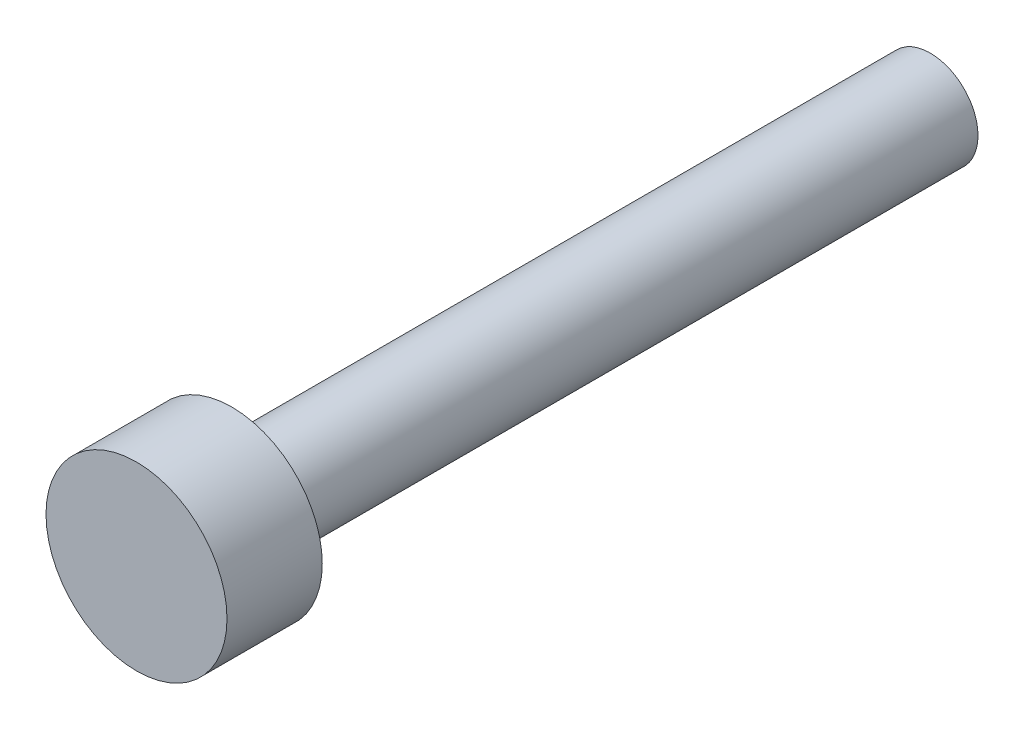
ISO-10303-21;
HEADER;
FILE_DESCRIPTION(('STEP AP214'),'2;1');
FILE_NAME('part.step','',(''),(''),'','','');
FILE_SCHEMA(('AUTOMOTIVE_DESIGN { 1 0 10303 214 1 1 1 1 }'));
ENDSEC;
DATA;
#1=APPLICATION_CONTEXT('core data for automotive mechanical design processes');
#2=APPLICATION_PROTOCOL_DEFINITION('international standard','automotive_design',2000,#1);
#3=PRODUCT_CONTEXT('',#1,'mechanical');
#4=PRODUCT('Part','Part','',(#3));
#5=PRODUCT_RELATED_PRODUCT_CATEGORY('part','',(#4));
#6=PRODUCT_DEFINITION_FORMATION('','',#4);
#7=PRODUCT_DEFINITION_CONTEXT('part definition',#1,'design');
#8=PRODUCT_DEFINITION('design','',#6,#7);
#9=PRODUCT_DEFINITION_SHAPE('','',#8);
#10=(LENGTH_UNIT() NAMED_UNIT(*) SI_UNIT(.MILLI.,.METRE.));
#11=(NAMED_UNIT(*) PLANE_ANGLE_UNIT() SI_UNIT($,.RADIAN.));
#12=(NAMED_UNIT(*) SI_UNIT($,.STERADIAN.) SOLID_ANGLE_UNIT());
#13=UNCERTAINTY_MEASURE_WITH_UNIT(LENGTH_MEASURE(1.E-05),#10,'distance_accuracy_value','');
#14=(GEOMETRIC_REPRESENTATION_CONTEXT(3) GLOBAL_UNCERTAINTY_ASSIGNED_CONTEXT((#13)) GLOBAL_UNIT_ASSIGNED_CONTEXT((#10,
#11,#12)) REPRESENTATION_CONTEXT('',''));
#15=CARTESIAN_POINT('',(0.,0.,0.));
#16=DIRECTION('',(0.,0.,1.));
#17=DIRECTION('',(1.,0.,0.));
#18=AXIS2_PLACEMENT_3D('',#15,#16,#17);
#19=CARTESIAN_POINT('',(0.,0.,22.));
#20=DIRECTION('',(0.,0.,-1.));
#21=DIRECTION('',(-1.,0.,0.));
#22=AXIS2_PLACEMENT_3D('',#19,#20,#21);
#23=CYLINDRICAL_SURFACE('',#22,1.5);
#24=CARTESIAN_POINT('',(0.,0.,22.));
#25=DIRECTION('',(0.,0.,1.));
#26=DIRECTION('',(1.,0.,0.));
#27=AXIS2_PLACEMENT_3D('',#24,#25,#26);
#28=CIRCLE('',#27,1.5);
#29=CARTESIAN_POINT('',(1.5,0.,22.));
#30=VERTEX_POINT('',#29);
#31=EDGE_CURVE('E10',#30,#30,#28,.T.);
#32=ORIENTED_EDGE('',*,*,#31,.F.);
#33=EDGE_LOOP('',(#32));
#34=FACE_BOUND('',#33,.T.);
#35=CARTESIAN_POINT('',(0.,0.,0.));
#36=DIRECTION('',(0.,0.,1.));
#37=DIRECTION('',(1.,0.,0.));
#38=AXIS2_PLACEMENT_3D('',#35,#36,#37);
#39=CIRCLE('',#38,1.5);
#40=CARTESIAN_POINT('',(1.5,0.,0.));
#41=VERTEX_POINT('',#40);
#42=EDGE_CURVE('E34',#41,#41,#39,.T.);
#43=ORIENTED_EDGE('',*,*,#42,.T.);
#44=EDGE_LOOP('',(#43));
#45=FACE_BOUND('',#44,.T.);
#46=ADVANCED_FACE('F31',(#34,#45),#23,.T.);
#47=CARTESIAN_POINT('',(0.,0.,0.));
#48=DIRECTION('',(0.,0.,1.));
#49=DIRECTION('',(1.,0.,0.));
#50=AXIS2_PLACEMENT_3D('',#47,#48,#49);
#51=PLANE('',#50);
#52=ORIENTED_EDGE('',*,*,#42,.F.);
#53=EDGE_LOOP('',(#52));
#54=FACE_BOUND('',#53,.T.);
#55=ADVANCED_FACE('F54',(#54),#51,.F.);
#56=CARTESIAN_POINT('',(0.,0.,25.));
#57=DIRECTION('',(0.,0.,-1.));
#58=DIRECTION('',(-1.,0.,0.));
#59=AXIS2_PLACEMENT_3D('',#56,#57,#58);
#60=CYLINDRICAL_SURFACE('',#59,2.85);
#61=CARTESIAN_POINT('',(0.,0.,25.));
#62=DIRECTION('',(0.,0.,1.));
#63=DIRECTION('',(1.,0.,0.));
#64=AXIS2_PLACEMENT_3D('',#61,#62,#63);
#65=CIRCLE('',#64,2.85);
#66=CARTESIAN_POINT('',(2.85,0.,25.));
#67=VERTEX_POINT('',#66);
#68=EDGE_CURVE('E41',#67,#67,#65,.T.);
#69=ORIENTED_EDGE('',*,*,#68,.F.);
#70=EDGE_LOOP('',(#69));
#71=FACE_BOUND('',#70,.T.);
#72=CARTESIAN_POINT('',(0.,0.,22.));
#73=DIRECTION('',(0.,0.,1.));
#74=DIRECTION('',(1.,0.,0.));
#75=AXIS2_PLACEMENT_3D('',#72,#73,#74);
#76=CIRCLE('',#75,2.85);
#77=CARTESIAN_POINT('',(2.85,0.,22.));
#78=VERTEX_POINT('',#77);
#79=EDGE_CURVE('E43',#78,#78,#76,.T.);
#80=ORIENTED_EDGE('',*,*,#79,.T.);
#81=EDGE_LOOP('',(#80));
#82=FACE_BOUND('',#81,.T.);
#83=ADVANCED_FACE('F51',(#71,#82),#60,.T.);
#84=CARTESIAN_POINT('',(0.,0.,25.));
#85=DIRECTION('',(0.,0.,1.));
#86=DIRECTION('',(1.,0.,0.));
#87=AXIS2_PLACEMENT_3D('',#84,#85,#86);
#88=PLANE('',#87);
#89=ORIENTED_EDGE('',*,*,#68,.T.);
#90=EDGE_LOOP('',(#89));
#91=FACE_BOUND('',#90,.T.);
#92=ADVANCED_FACE('F49',(#91),#88,.T.);
#93=CARTESIAN_POINT('',(0.,0.,22.));
#94=DIRECTION('',(0.,0.,1.));
#95=DIRECTION('',(1.,0.,0.));
#96=AXIS2_PLACEMENT_3D('',#93,#94,#95);
#97=PLANE('',#96);
#98=ORIENTED_EDGE('',*,*,#31,.T.);
#99=EDGE_LOOP('',(#98));
#100=FACE_BOUND('',#99,.T.);
#101=ORIENTED_EDGE('',*,*,#79,.F.);
#102=EDGE_LOOP('',(#101));
#103=FACE_BOUND('',#102,.T.);
#104=ADVANCED_FACE('F58',(#100,#103),#97,.F.);
#105=CLOSED_SHELL('',(#46,#55,#83,#92,#104));
#106=MANIFOLD_SOLID_BREP('B2',#105);
#107=ADVANCED_BREP_SHAPE_REPRESENTATION('',(#18,#106),#14);
#108=SHAPE_DEFINITION_REPRESENTATION(#9,#107);
ENDSEC;
END-ISO-10303-21;
